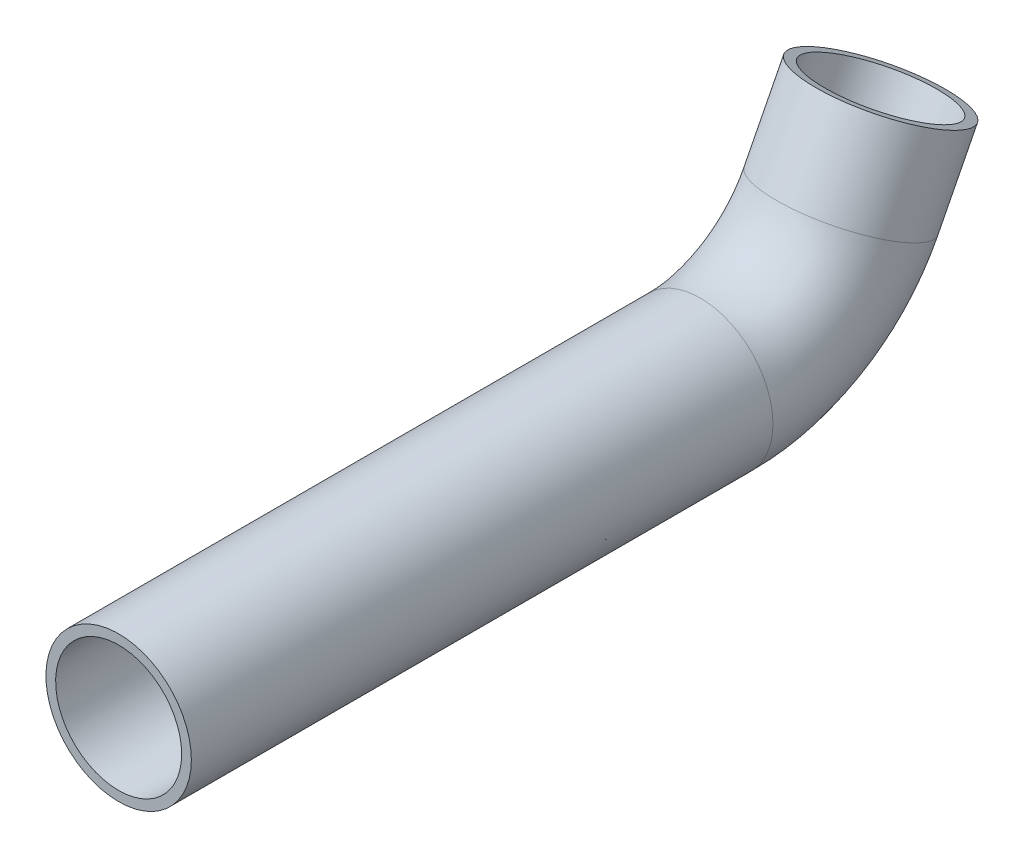
ISO-10303-21;
HEADER;
FILE_DESCRIPTION(('STEP AP214'),'2;1');
FILE_NAME('part.step','',(''),(''),'','','');
FILE_SCHEMA(('AUTOMOTIVE_DESIGN { 1 0 10303 214 1 1 1 1 }'));
ENDSEC;
DATA;
#1=APPLICATION_CONTEXT('core data for automotive mechanical design processes');
#2=APPLICATION_PROTOCOL_DEFINITION('international standard','automotive_design',2000,#1);
#3=PRODUCT_CONTEXT('',#1,'mechanical');
#4=PRODUCT('Part','Part','',(#3));
#5=PRODUCT_RELATED_PRODUCT_CATEGORY('part','',(#4));
#6=PRODUCT_DEFINITION_FORMATION('','',#4);
#7=PRODUCT_DEFINITION_CONTEXT('part definition',#1,'design');
#8=PRODUCT_DEFINITION('design','',#6,#7);
#9=PRODUCT_DEFINITION_SHAPE('','',#8);
#10=(LENGTH_UNIT() NAMED_UNIT(*) SI_UNIT(.MILLI.,.METRE.));
#11=(NAMED_UNIT(*) PLANE_ANGLE_UNIT() SI_UNIT($,.RADIAN.));
#12=(NAMED_UNIT(*) SI_UNIT($,.STERADIAN.) SOLID_ANGLE_UNIT());
#13=UNCERTAINTY_MEASURE_WITH_UNIT(LENGTH_MEASURE(1.E-05),#10,'distance_accuracy_value','');
#14=(GEOMETRIC_REPRESENTATION_CONTEXT(3) GLOBAL_UNCERTAINTY_ASSIGNED_CONTEXT((#13)) GLOBAL_UNIT_ASSIGNED_CONTEXT((#10,
#11,#12)) REPRESENTATION_CONTEXT('',''));
#15=CARTESIAN_POINT('',(0.,0.,0.));
#16=DIRECTION('',(0.,0.,1.));
#17=DIRECTION('',(1.,0.,0.));
#18=AXIS2_PLACEMENT_3D('',#15,#16,#17);
#19=CARTESIAN_POINT('',(0.,0.,15138.4));
#20=DIRECTION('',(0.,0.,-1.));
#21=DIRECTION('',(-1.,0.,0.));
#22=AXIS2_PLACEMENT_3D('',#19,#20,#21);
#23=CYLINDRICAL_SURFACE('',#22,1905.);
#24=CARTESIAN_POINT('',(0.,0.,15138.4));
#25=DIRECTION('',(0.,0.,1.));
#26=DIRECTION('',(1.,0.,0.));
#27=AXIS2_PLACEMENT_3D('',#24,#25,#26);
#28=CIRCLE('',#27,1905.);
#29=CARTESIAN_POINT('',(1905.,0.,15138.4));
#30=VERTEX_POINT('',#29);
#31=EDGE_CURVE('E10',#30,#30,#28,.T.);
#32=ORIENTED_EDGE('',*,*,#31,.F.);
#33=EDGE_LOOP('',(#32));
#34=FACE_BOUND('',#33,.T.);
#35=CARTESIAN_POINT('',(0.,0.,-101.6));
#36=DIRECTION('',(0.,0.,-1.));
#37=DIRECTION('',(-1.,0.,0.));
#38=AXIS2_PLACEMENT_3D('',#35,#36,#37);
#39=CIRCLE('',#38,1905.);
#40=CARTESIAN_POINT('',(0.,-1905.,-101.6));
#41=VERTEX_POINT('',#40);
#42=EDGE_CURVE('E54',#41,#41,#39,.T.);
#43=ORIENTED_EDGE('',*,*,#42,.F.);
#44=EDGE_LOOP('',(#43));
#45=FACE_BOUND('',#44,.T.);
#46=ADVANCED_FACE('F37',(#34,#45),#23,.T.);
#47=CARTESIAN_POINT('',(0.,0.,15138.4));
#48=DIRECTION('',(0.,0.,1.));
#49=DIRECTION('',(1.,0.,0.));
#50=AXIS2_PLACEMENT_3D('',#47,#48,#49);
#51=PLANE('',#50);
#52=CARTESIAN_POINT('',(0.,0.,15138.4));
#53=DIRECTION('',(0.,0.,1.));
#54=DIRECTION('',(1.,0.,0.));
#55=AXIS2_PLACEMENT_3D('',#52,#53,#54);
#56=CIRCLE('',#55,1651.);
#57=CARTESIAN_POINT('',(1651.,0.,15138.4));
#58=VERTEX_POINT('',#57);
#59=EDGE_CURVE('E44',#58,#58,#56,.T.);
#60=ORIENTED_EDGE('',*,*,#59,.F.);
#61=EDGE_LOOP('',(#60));
#62=FACE_BOUND('',#61,.T.);
#63=ORIENTED_EDGE('',*,*,#31,.T.);
#64=EDGE_LOOP('',(#63));
#65=FACE_BOUND('',#64,.T.);
#66=ADVANCED_FACE('F95',(#62,#65),#51,.T.);
#67=CARTESIAN_POINT('',(0.,0.,15138.4));
#68=DIRECTION('',(0.,0.,-1.));
#69=DIRECTION('',(-1.,0.,0.));
#70=AXIS2_PLACEMENT_3D('',#67,#68,#69);
#71=CYLINDRICAL_SURFACE('',#70,1651.);
#72=ORIENTED_EDGE('',*,*,#59,.T.);
#73=EDGE_LOOP('',(#72));
#74=FACE_BOUND('',#73,.T.);
#75=CARTESIAN_POINT('',(0.,0.,-101.599999999999));
#76=DIRECTION('',(0.,0.,1.));
#77=DIRECTION('',(0.,-1.,0.));
#78=AXIS2_PLACEMENT_3D('',#75,#76,#77);
#79=CIRCLE('',#78,1651.);
#80=CARTESIAN_POINT('',(0.,-1651.,-101.599999999999));
#81=VERTEX_POINT('',#80);
#82=EDGE_CURVE('E69',#81,#81,#79,.F.);
#83=ORIENTED_EDGE('',*,*,#82,.T.);
#84=EDGE_LOOP('',(#83));
#85=FACE_BOUND('',#84,.T.);
#86=ADVANCED_FACE('F77',(#74,#85),#71,.F.);
#87=CARTESIAN_POINT('',(0.,4140.2,-101.6));
#88=DIRECTION('',(1.,0.,0.));
#89=DIRECTION('',(0.,0.,-1.));
#90=AXIS2_PLACEMENT_3D('',#87,#88,#89);
#91=TOROIDAL_SURFACE('',#90,4140.2,1905.);
#92=CARTESIAN_POINT('',(0.,2260.58853297829,-3790.54521144466));
#93=DIRECTION('',(0.,0.891006524188363,-0.453990499739556));
#94=DIRECTION('',(-1.,0.,0.));
#95=AXIS2_PLACEMENT_3D('',#92,#93,#94);
#96=CIRCLE('',#95,1905.);
#97=CARTESIAN_POINT('',(0.,1395.73663097443,-5487.91264002349));
#98=VERTEX_POINT('',#97);
#99=EDGE_CURVE('E49',#98,#98,#96,.T.);
#100=CARTESIAN_POINT('',(0.,4140.2,-101.6));
#101=DIRECTION('',(1.,0.,0.));
#102=DIRECTION('',(0.,0.,-1.));
#103=AXIS2_PLACEMENT_3D('',#100,#101,#102);
#104=CIRCLE('',#103,6045.2);
#105=EDGE_CURVE('',#41,#98,#104,.T.);
#106=ORIENTED_EDGE('',*,*,#42,.T.);
#107=ORIENTED_EDGE('',*,*,#99,.F.);
#108=ORIENTED_EDGE('',*,*,#105,.T.);
#109=ORIENTED_EDGE('',*,*,#105,.F.);
#110=EDGE_LOOP('',(#106,#108,#107,#109));
#111=FACE_BOUND('',#110,.T.);
#112=ADVANCED_FACE('F104',(#111),#91,.T.);
#113=CARTESIAN_POINT('',(0.,4297.42944727289,-4828.36749384929));
#114=DIRECTION('',(0.,-0.891006524188363,0.453990499739557));
#115=DIRECTION('',(0.,-0.453990499739557,-0.891006524188363));
#116=AXIS2_PLACEMENT_3D('',#113,#114,#115);
#117=CYLINDRICAL_SURFACE('',#116,1905.);
#118=CARTESIAN_POINT('',(0.,4297.42944727289,-4828.36749384929));
#119=DIRECTION('',(0.,0.891006524188363,-0.453990499739557));
#120=DIRECTION('',(0.,0.453990499739556,0.891006524188363));
#121=AXIS2_PLACEMENT_3D('',#118,#119,#120);
#122=CIRCLE('',#121,1905.);
#123=CARTESIAN_POINT('',(0.,5162.28134927674,-3131.00006527046));
#124=VERTEX_POINT('',#123);
#125=EDGE_CURVE('E60',#124,#124,#122,.T.);
#126=ORIENTED_EDGE('',*,*,#125,.F.);
#127=EDGE_LOOP('',(#126));
#128=FACE_BOUND('',#127,.T.);
#129=ORIENTED_EDGE('',*,*,#99,.T.);
#130=EDGE_LOOP('',(#129));
#131=FACE_BOUND('',#130,.T.);
#132=ADVANCED_FACE('F91',(#128,#131),#117,.T.);
#133=CARTESIAN_POINT('',(0.,4297.42944727289,-4828.36749384929));
#134=DIRECTION('',(0.,0.891006524188363,-0.453990499739557));
#135=DIRECTION('',(0.,0.453990499739556,0.891006524188363));
#136=AXIS2_PLACEMENT_3D('',#133,#134,#135);
#137=PLANE('',#136);
#138=CARTESIAN_POINT('',(0.,4297.42944727289,-4828.36749384929));
#139=DIRECTION('',(0.,0.891006524188363,-0.453990499739557));
#140=DIRECTION('',(0.,0.453990499739556,0.891006524188363));
#141=AXIS2_PLACEMENT_3D('',#138,#139,#140);
#142=CIRCLE('',#141,1651.);
#143=CARTESIAN_POINT('',(0.,5046.96776234289,-3357.3157224143));
#144=VERTEX_POINT('',#143);
#145=EDGE_CURVE('E65',#144,#144,#142,.T.);
#146=ORIENTED_EDGE('',*,*,#145,.F.);
#147=EDGE_LOOP('',(#146));
#148=FACE_BOUND('',#147,.T.);
#149=ORIENTED_EDGE('',*,*,#125,.T.);
#150=EDGE_LOOP('',(#149));
#151=FACE_BOUND('',#150,.T.);
#152=ADVANCED_FACE('F82',(#148,#151),#137,.T.);
#153=CARTESIAN_POINT('',(0.,4140.2,-101.6));
#154=DIRECTION('',(1.,0.,0.));
#155=DIRECTION('',(0.,0.,-1.));
#156=AXIS2_PLACEMENT_3D('',#153,#154,#155);
#157=TOROIDAL_SURFACE('',#156,4140.2,1651.);
#158=CARTESIAN_POINT('',(0.,2260.58853297829,-3790.54521144466));
#159=DIRECTION('',(0.,-0.891006524188363,0.453990499739557));
#160=DIRECTION('',(0.,-0.453990499739557,-0.891006524188363));
#161=AXIS2_PLACEMENT_3D('',#158,#159,#160);
#162=CIRCLE('',#161,1651.);
#163=CARTESIAN_POINT('',(0.,1511.05021790828,-5261.59698287965));
#164=VERTEX_POINT('',#163);
#165=EDGE_CURVE('E64',#164,#164,#162,.F.);
#166=CARTESIAN_POINT('',(0.,4140.2,-101.6));
#167=DIRECTION('',(1.,0.,0.));
#168=DIRECTION('',(0.,0.,-1.));
#169=AXIS2_PLACEMENT_3D('',#166,#167,#168);
#170=CIRCLE('',#169,5791.2);
#171=EDGE_CURVE('',#81,#164,#170,.T.);
#172=ORIENTED_EDGE('',*,*,#82,.F.);
#173=ORIENTED_EDGE('',*,*,#165,.T.);
#174=ORIENTED_EDGE('',*,*,#171,.T.);
#175=ORIENTED_EDGE('',*,*,#171,.F.);
#176=EDGE_LOOP('',(#172,#174,#173,#175));
#177=FACE_BOUND('',#176,.T.);
#178=ADVANCED_FACE('F79',(#177),#157,.F.);
#179=CARTESIAN_POINT('',(0.,4297.42944727289,-4828.36749384929));
#180=DIRECTION('',(0.,-0.891006524188363,0.453990499739557));
#181=DIRECTION('',(0.,-0.453990499739557,-0.891006524188363));
#182=AXIS2_PLACEMENT_3D('',#179,#180,#181);
#183=CYLINDRICAL_SURFACE('',#182,1651.);
#184=ORIENTED_EDGE('',*,*,#145,.T.);
#185=EDGE_LOOP('',(#184));
#186=FACE_BOUND('',#185,.T.);
#187=ORIENTED_EDGE('',*,*,#165,.F.);
#188=EDGE_LOOP('',(#187));
#189=FACE_BOUND('',#188,.T.);
#190=ADVANCED_FACE('F81',(#186,#189),#183,.F.);
#191=CLOSED_SHELL('',(#46,#66,#86,#112,#132,#152,#178,#190));
#192=MANIFOLD_SOLID_BREP('B2',#191);
#193=ADVANCED_BREP_SHAPE_REPRESENTATION('',(#18,#192),#14);
#194=SHAPE_DEFINITION_REPRESENTATION(#9,#193);
ENDSEC;
END-ISO-10303-21;
